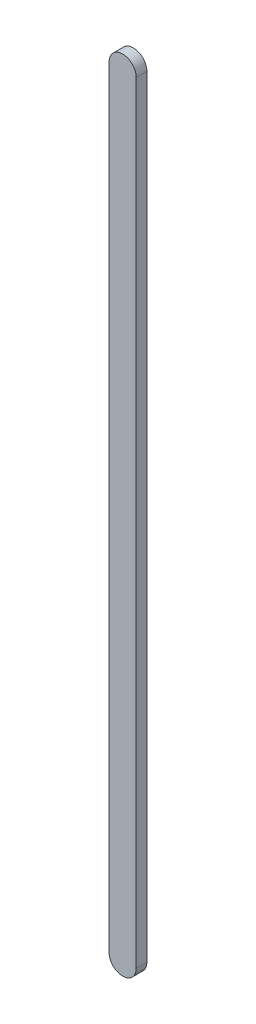
ISO-10303-21;
HEADER;
FILE_DESCRIPTION(('STEP AP214'),'2;1');
FILE_NAME('part.step','',(''),(''),'','','');
FILE_SCHEMA(('AUTOMOTIVE_DESIGN { 1 0 10303 214 1 1 1 1 }'));
ENDSEC;
DATA;
#1=APPLICATION_CONTEXT('core data for automotive mechanical design processes');
#2=APPLICATION_PROTOCOL_DEFINITION('international standard','automotive_design',2000,#1);
#3=PRODUCT_CONTEXT('',#1,'mechanical');
#4=PRODUCT('Part','Part','',(#3));
#5=PRODUCT_RELATED_PRODUCT_CATEGORY('part','',(#4));
#6=PRODUCT_DEFINITION_FORMATION('','',#4);
#7=PRODUCT_DEFINITION_CONTEXT('part definition',#1,'design');
#8=PRODUCT_DEFINITION('design','',#6,#7);
#9=PRODUCT_DEFINITION_SHAPE('','',#8);
#10=(LENGTH_UNIT() NAMED_UNIT(*) SI_UNIT(.MILLI.,.METRE.));
#11=(NAMED_UNIT(*) PLANE_ANGLE_UNIT() SI_UNIT($,.RADIAN.));
#12=(NAMED_UNIT(*) SI_UNIT($,.STERADIAN.) SOLID_ANGLE_UNIT());
#13=UNCERTAINTY_MEASURE_WITH_UNIT(LENGTH_MEASURE(1.E-05),#10,'distance_accuracy_value','');
#14=(GEOMETRIC_REPRESENTATION_CONTEXT(3) GLOBAL_UNCERTAINTY_ASSIGNED_CONTEXT((#13)) GLOBAL_UNIT_ASSIGNED_CONTEXT((#10,
#11,#12)) REPRESENTATION_CONTEXT('',''));
#15=CARTESIAN_POINT('',(0.,0.,0.));
#16=DIRECTION('',(0.,0.,1.));
#17=DIRECTION('',(1.,0.,0.));
#18=AXIS2_PLACEMENT_3D('',#15,#16,#17);
#19=CARTESIAN_POINT('',(87.503,54.356,0.));
#20=DIRECTION('',(-1.,0.,0.));
#21=DIRECTION('',(0.,1.,0.));
#22=AXIS2_PLACEMENT_3D('',#19,#20,#21);
#23=PLANE('',#22);
#24=DIRECTION('',(0.,1.,0.));
#25=VECTOR('',#24,1.);
#26=CARTESIAN_POINT('',(87.503,54.356,0.1999996));
#27=LINE('',#26,#25);
#28=CARTESIAN_POINT('',(87.503,54.356,0.1999996));
#29=VERTEX_POINT('',#28);
#30=CARTESIAN_POINT('',(87.503,68.834,0.1999996));
#31=VERTEX_POINT('',#30);
#32=EDGE_CURVE('E11',#29,#31,#27,.T.);
#33=ORIENTED_EDGE('',*,*,#32,.F.);
#34=DIRECTION('',(0.,0.,1.));
#35=VECTOR('',#34,1.);
#36=CARTESIAN_POINT('',(87.503,54.356,0.));
#37=LINE('',#36,#35);
#38=CARTESIAN_POINT('',(87.503,54.356,0.));
#39=VERTEX_POINT('',#38);
#40=EDGE_CURVE('E24',#39,#29,#37,.T.);
#41=ORIENTED_EDGE('',*,*,#40,.F.);
#42=DIRECTION('',(0.,1.,0.));
#43=VECTOR('',#42,1.);
#44=CARTESIAN_POINT('',(87.503,54.356,0.));
#45=LINE('',#44,#43);
#46=CARTESIAN_POINT('',(87.503,68.834,0.));
#47=VERTEX_POINT('',#46);
#48=EDGE_CURVE('E75',#39,#47,#45,.T.);
#49=ORIENTED_EDGE('',*,*,#48,.T.);
#50=DIRECTION('',(0.,0.,1.));
#51=VECTOR('',#50,1.);
#52=CARTESIAN_POINT('',(87.503,68.834,0.));
#53=LINE('',#52,#51);
#54=EDGE_CURVE('E37',#47,#31,#53,.T.);
#55=ORIENTED_EDGE('',*,*,#54,.T.);
#56=EDGE_LOOP('',(#33,#41,#49,#55));
#57=FACE_BOUND('',#56,.T.);
#58=ADVANCED_FACE('F17',(#57),#23,.F.);
#59=CARTESIAN_POINT('',(87.249,68.834,0.));
#60=DIRECTION('',(0.,0.,-1.));
#61=DIRECTION('',(1.,0.,0.));
#62=AXIS2_PLACEMENT_3D('',#59,#60,#61);
#63=CYLINDRICAL_SURFACE('',#62,0.254);
#64=CARTESIAN_POINT('',(87.249,68.834,0.1999996));
#65=DIRECTION('',(0.,0.,1.));
#66=DIRECTION('',(1.,0.,0.));
#67=AXIS2_PLACEMENT_3D('',#64,#65,#66);
#68=CIRCLE('',#67,0.254);
#69=CARTESIAN_POINT('',(86.995,68.834,0.1999996));
#70=VERTEX_POINT('',#69);
#71=EDGE_CURVE('E83',#31,#70,#68,.T.);
#72=ORIENTED_EDGE('',*,*,#71,.F.);
#73=ORIENTED_EDGE('',*,*,#54,.F.);
#74=CARTESIAN_POINT('',(87.249,68.834,0.));
#75=DIRECTION('',(0.,0.,1.));
#76=DIRECTION('',(1.,0.,0.));
#77=AXIS2_PLACEMENT_3D('',#74,#75,#76);
#78=CIRCLE('',#77,0.254);
#79=CARTESIAN_POINT('',(86.995,68.834,0.));
#80=VERTEX_POINT('',#79);
#81=EDGE_CURVE('E81',#47,#80,#78,.T.);
#82=ORIENTED_EDGE('',*,*,#81,.T.);
#83=DIRECTION('',(0.,0.,1.));
#84=VECTOR('',#83,1.);
#85=CARTESIAN_POINT('',(86.995,68.834,0.));
#86=LINE('',#85,#84);
#87=EDGE_CURVE('E67',#80,#70,#86,.T.);
#88=ORIENTED_EDGE('',*,*,#87,.T.);
#89=EDGE_LOOP('',(#72,#73,#82,#88));
#90=FACE_BOUND('',#89,.T.);
#91=ADVANCED_FACE('F89',(#90),#63,.T.);
#92=CARTESIAN_POINT('',(86.995,68.834,0.));
#93=DIRECTION('',(1.,0.,0.));
#94=DIRECTION('',(0.,-1.,0.));
#95=AXIS2_PLACEMENT_3D('',#92,#93,#94);
#96=PLANE('',#95);
#97=DIRECTION('',(0.,-1.,0.));
#98=VECTOR('',#97,1.);
#99=CARTESIAN_POINT('',(86.995,68.834,0.1999996));
#100=LINE('',#99,#98);
#101=CARTESIAN_POINT('',(86.995,54.356,0.1999996));
#102=VERTEX_POINT('',#101);
#103=EDGE_CURVE('E71',#70,#102,#100,.T.);
#104=ORIENTED_EDGE('',*,*,#103,.F.);
#105=ORIENTED_EDGE('',*,*,#87,.F.);
#106=DIRECTION('',(0.,-1.,0.));
#107=VECTOR('',#106,1.);
#108=CARTESIAN_POINT('',(86.995,68.834,0.));
#109=LINE('',#108,#107);
#110=CARTESIAN_POINT('',(86.995,54.356,0.));
#111=VERTEX_POINT('',#110);
#112=EDGE_CURVE('E63',#80,#111,#109,.T.);
#113=ORIENTED_EDGE('',*,*,#112,.T.);
#114=DIRECTION('',(0.,0.,1.));
#115=VECTOR('',#114,1.);
#116=CARTESIAN_POINT('',(86.995,54.356,0.));
#117=LINE('',#116,#115);
#118=EDGE_CURVE('E53',#111,#102,#117,.T.);
#119=ORIENTED_EDGE('',*,*,#118,.T.);
#120=EDGE_LOOP('',(#104,#105,#113,#119));
#121=FACE_BOUND('',#120,.T.);
#122=ADVANCED_FACE('F66',(#121),#96,.F.);
#123=CARTESIAN_POINT('',(87.249,54.356,0.));
#124=DIRECTION('',(0.,0.,-1.));
#125=DIRECTION('',(-1.,0.,0.));
#126=AXIS2_PLACEMENT_3D('',#123,#124,#125);
#127=CYLINDRICAL_SURFACE('',#126,0.253999999999998);
#128=CARTESIAN_POINT('',(87.249,54.356,0.1999996));
#129=DIRECTION('',(0.,0.,1.));
#130=DIRECTION('',(-1.,0.,0.));
#131=AXIS2_PLACEMENT_3D('',#128,#129,#130);
#132=CIRCLE('',#131,0.253999999999998);
#133=EDGE_CURVE('E59',#102,#29,#132,.T.);
#134=ORIENTED_EDGE('',*,*,#133,.F.);
#135=ORIENTED_EDGE('',*,*,#118,.F.);
#136=CARTESIAN_POINT('',(87.249,54.356,0.));
#137=DIRECTION('',(0.,0.,1.));
#138=DIRECTION('',(-1.,0.,0.));
#139=AXIS2_PLACEMENT_3D('',#136,#137,#138);
#140=CIRCLE('',#139,0.253999999999998);
#141=EDGE_CURVE('E57',#111,#39,#140,.T.);
#142=ORIENTED_EDGE('',*,*,#141,.T.);
#143=ORIENTED_EDGE('',*,*,#40,.T.);
#144=EDGE_LOOP('',(#134,#135,#142,#143));
#145=FACE_BOUND('',#144,.T.);
#146=ADVANCED_FACE('F55',(#145),#127,.T.);
#147=CARTESIAN_POINT('',(87.503,54.356,0.));
#148=DIRECTION('',(0.,0.,-1.));
#149=DIRECTION('',(-1.,0.,0.));
#150=AXIS2_PLACEMENT_3D('',#147,#148,#149);
#151=PLANE('',#150);
#152=ORIENTED_EDGE('',*,*,#141,.F.);
#153=ORIENTED_EDGE('',*,*,#112,.F.);
#154=ORIENTED_EDGE('',*,*,#81,.F.);
#155=ORIENTED_EDGE('',*,*,#48,.F.);
#156=EDGE_LOOP('',(#152,#153,#154,#155));
#157=FACE_BOUND('',#156,.T.);
#158=ADVANCED_FACE('F74',(#157),#151,.T.);
#159=CARTESIAN_POINT('',(87.503,54.356,0.1999996));
#160=DIRECTION('',(0.,0.,-1.));
#161=DIRECTION('',(-1.,0.,0.));
#162=AXIS2_PLACEMENT_3D('',#159,#160,#161);
#163=PLANE('',#162);
#164=ORIENTED_EDGE('',*,*,#32,.T.);
#165=ORIENTED_EDGE('',*,*,#71,.T.);
#166=ORIENTED_EDGE('',*,*,#103,.T.);
#167=ORIENTED_EDGE('',*,*,#133,.T.);
#168=EDGE_LOOP('',(#164,#165,#166,#167));
#169=FACE_BOUND('',#168,.T.);
#170=ADVANCED_FACE('F91',(#169),#163,.F.);
#171=CLOSED_SHELL('',(#58,#91,#122,#146,#158,#170));
#172=MANIFOLD_SOLID_BREP('B1',#171);
#173=ADVANCED_BREP_SHAPE_REPRESENTATION('',(#18,#172),#14);
#174=SHAPE_DEFINITION_REPRESENTATION(#9,#173);
ENDSEC;
END-ISO-10303-21;
